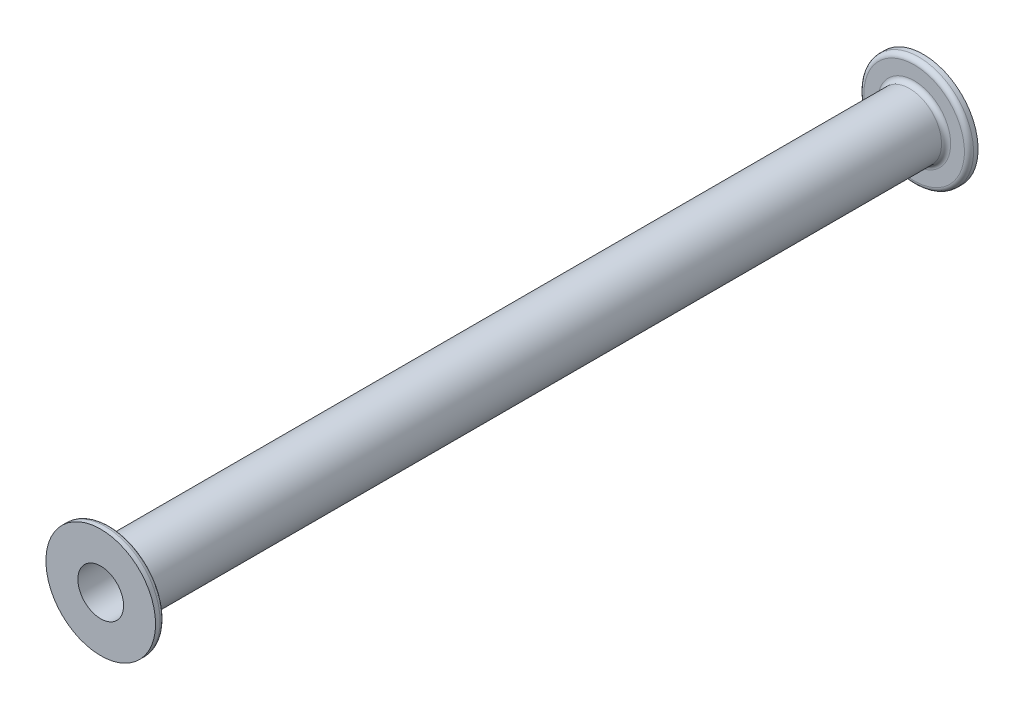
ISO-10303-21;
HEADER;
FILE_DESCRIPTION(('STEP AP214'),'2;1');
FILE_NAME('part.step','',(''),(''),'','','');
FILE_SCHEMA(('AUTOMOTIVE_DESIGN { 1 0 10303 214 1 1 1 1 }'));
ENDSEC;
DATA;
#1=APPLICATION_CONTEXT('core data for automotive mechanical design processes');
#2=APPLICATION_PROTOCOL_DEFINITION('international standard','automotive_design',2000,#1);
#3=PRODUCT_CONTEXT('',#1,'mechanical');
#4=PRODUCT('Part','Part','',(#3));
#5=PRODUCT_RELATED_PRODUCT_CATEGORY('part','',(#4));
#6=PRODUCT_DEFINITION_FORMATION('','',#4);
#7=PRODUCT_DEFINITION_CONTEXT('part definition',#1,'design');
#8=PRODUCT_DEFINITION('design','',#6,#7);
#9=PRODUCT_DEFINITION_SHAPE('','',#8);
#10=(LENGTH_UNIT() NAMED_UNIT(*) SI_UNIT(.MILLI.,.METRE.));
#11=(NAMED_UNIT(*) PLANE_ANGLE_UNIT() SI_UNIT($,.RADIAN.));
#12=(NAMED_UNIT(*) SI_UNIT($,.STERADIAN.) SOLID_ANGLE_UNIT());
#13=UNCERTAINTY_MEASURE_WITH_UNIT(LENGTH_MEASURE(1.E-05),#10,'distance_accuracy_value','');
#14=(GEOMETRIC_REPRESENTATION_CONTEXT(3) GLOBAL_UNCERTAINTY_ASSIGNED_CONTEXT((#13)) GLOBAL_UNIT_ASSIGNED_CONTEXT((#10,
#11,#12)) REPRESENTATION_CONTEXT('',''));
#15=CARTESIAN_POINT('',(0.,0.,0.));
#16=DIRECTION('',(0.,0.,1.));
#17=DIRECTION('',(1.,0.,0.));
#18=AXIS2_PLACEMENT_3D('',#15,#16,#17);
#19=CARTESIAN_POINT('',(0.,0.,90.));
#20=DIRECTION('',(0.,0.,-1.));
#21=DIRECTION('',(-1.,0.,0.));
#22=AXIS2_PLACEMENT_3D('',#19,#20,#21);
#23=CYLINDRICAL_SURFACE('',#22,3.5);
#24=CARTESIAN_POINT('',(0.,0.,88.5));
#25=DIRECTION('',(0.,0.,1.));
#26=DIRECTION('',(1.,0.,0.));
#27=AXIS2_PLACEMENT_3D('',#24,#25,#26);
#28=CIRCLE('',#27,3.5);
#29=CARTESIAN_POINT('',(-3.5,0.,88.5));
#30=VERTEX_POINT('',#29);
#31=EDGE_CURVE('E53',#30,#30,#28,.F.);
#32=CARTESIAN_POINT('',(0.,0.,1.5));
#33=DIRECTION('',(0.,0.,-1.));
#34=DIRECTION('',(-1.,0.,0.));
#35=AXIS2_PLACEMENT_3D('',#32,#33,#34);
#36=CIRCLE('',#35,3.5);
#37=CARTESIAN_POINT('',(-3.5,0.,1.50000000000002));
#38=VERTEX_POINT('',#37);
#39=EDGE_CURVE('E58',#38,#38,#36,.F.);
#40=CARTESIAN_POINT('',(-3.5,0.,88.5));
#41=CARTESIAN_POINT('',(-3.5,0.,87.59375));
#42=CARTESIAN_POINT('',(-3.5,0.,86.6875));
#43=CARTESIAN_POINT('',(-3.5,0.,84.875));
#44=CARTESIAN_POINT('',(-3.5,0.,83.96875));
#45=CARTESIAN_POINT('',(-3.5,0.,82.15625));
#46=CARTESIAN_POINT('',(-3.5,0.,81.25));
#47=CARTESIAN_POINT('',(-3.5,0.,79.4375));
#48=CARTESIAN_POINT('',(-3.5,0.,78.53125));
#49=CARTESIAN_POINT('',(-3.5,0.,76.71875));
#50=CARTESIAN_POINT('',(-3.5,0.,75.8125));
#51=CARTESIAN_POINT('',(-3.5,0.,74.));
#52=CARTESIAN_POINT('',(-3.5,0.,73.09375));
#53=CARTESIAN_POINT('',(-3.5,0.,71.28125));
#54=CARTESIAN_POINT('',(-3.5,0.,70.375));
#55=CARTESIAN_POINT('',(-3.5,0.,68.5625));
#56=CARTESIAN_POINT('',(-3.5,0.,67.65625));
#57=CARTESIAN_POINT('',(-3.5,0.,65.84375));
#58=CARTESIAN_POINT('',(-3.5,0.,64.9375));
#59=CARTESIAN_POINT('',(-3.5,0.,63.125));
#60=CARTESIAN_POINT('',(-3.5,0.,62.21875));
#61=CARTESIAN_POINT('',(-3.5,0.,60.40625));
#62=CARTESIAN_POINT('',(-3.5,0.,59.5));
#63=CARTESIAN_POINT('',(-3.5,0.,57.6875));
#64=CARTESIAN_POINT('',(-3.5,0.,56.78125));
#65=CARTESIAN_POINT('',(-3.5,0.,54.96875));
#66=CARTESIAN_POINT('',(-3.5,0.,54.0625));
#67=CARTESIAN_POINT('',(-3.5,0.,52.25));
#68=CARTESIAN_POINT('',(-3.5,0.,51.34375));
#69=CARTESIAN_POINT('',(-3.5,0.,49.53125));
#70=CARTESIAN_POINT('',(-3.5,0.,48.625));
#71=CARTESIAN_POINT('',(-3.5,0.,46.8125));
#72=CARTESIAN_POINT('',(-3.5,0.,45.90625));
#73=CARTESIAN_POINT('',(-3.5,0.,44.09375));
#74=CARTESIAN_POINT('',(-3.5,0.,43.1875));
#75=CARTESIAN_POINT('',(-3.5,0.,41.375));
#76=CARTESIAN_POINT('',(-3.5,0.,40.46875));
#77=CARTESIAN_POINT('',(-3.5,0.,38.65625));
#78=CARTESIAN_POINT('',(-3.5,0.,37.75));
#79=CARTESIAN_POINT('',(-3.5,0.,35.9375));
#80=CARTESIAN_POINT('',(-3.5,0.,35.03125));
#81=CARTESIAN_POINT('',(-3.5,0.,33.21875));
#82=CARTESIAN_POINT('',(-3.5,0.,32.3125));
#83=CARTESIAN_POINT('',(-3.5,0.,30.5));
#84=CARTESIAN_POINT('',(-3.5,0.,29.59375));
#85=CARTESIAN_POINT('',(-3.5,0.,27.78125));
#86=CARTESIAN_POINT('',(-3.5,0.,26.875));
#87=CARTESIAN_POINT('',(-3.5,0.,25.0625));
#88=CARTESIAN_POINT('',(-3.5,0.,24.15625));
#89=CARTESIAN_POINT('',(-3.5,0.,22.34375));
#90=CARTESIAN_POINT('',(-3.5,0.,21.4375));
#91=CARTESIAN_POINT('',(-3.5,0.,19.625));
#92=CARTESIAN_POINT('',(-3.5,0.,18.71875));
#93=CARTESIAN_POINT('',(-3.5,0.,16.90625));
#94=CARTESIAN_POINT('',(-3.5,0.,16.));
#95=CARTESIAN_POINT('',(-3.5,0.,14.1875));
#96=CARTESIAN_POINT('',(-3.5,0.,13.28125));
#97=CARTESIAN_POINT('',(-3.5,0.,11.46875));
#98=CARTESIAN_POINT('',(-3.5,0.,10.5625));
#99=CARTESIAN_POINT('',(-3.5,0.,8.75000000000002));
#100=CARTESIAN_POINT('',(-3.5,0.,7.84375000000001));
#101=CARTESIAN_POINT('',(-3.5,0.,6.03125000000002));
#102=CARTESIAN_POINT('',(-3.5,0.,5.12500000000002));
#103=CARTESIAN_POINT('',(-3.5,0.,3.31250000000002));
#104=CARTESIAN_POINT('',(-3.5,0.,2.40625000000002));
#105=CARTESIAN_POINT('',(-3.5,0.,1.50000000000002));
#106=B_SPLINE_CURVE_WITH_KNOTS('',3,(#40,#41,#42,#43,#44,#45,#46,#47,#48,#49,#50,#51,#52,#53,
#54,#55,#56,#57,#58,#59,#60,#61,#62,#63,#64,#65,#66,#67,#68,#69,#70,#71,#72,#73,#74,#75,#76,#77,
#78,#79,#80,#81,#82,#83,#84,#85,#86,#87,#88,#89,#90,#91,#92,#93,#94,#95,#96,#97,#98,#99,#100,
#101,#102,#103,#104,#105),.UNSPECIFIED.,.F.,.F.,(4,2,2,2,2,2,2,2,2,2,2,2,2,2,2,2,2,2,2,2,2,2,2,
2,2,2,2,2,2,2,2,2,4),(0.,2.71874999999999,5.4375,8.15624999999999,10.875,13.59375,16.3125,
19.03125,21.75,24.46875,27.1875,29.90625,32.625,35.34375,38.0625,40.78125,43.5,46.21875,48.9375,
51.65625,54.375,57.09375,59.8125,62.53125,65.25,67.96875,70.6875,73.40625,76.125,78.84375,
81.5625,84.28125,87.),.UNSPECIFIED.);
#107=EDGE_CURVE('BSEAM38',#30,#38,#106,.T.);
#108=ORIENTED_EDGE('',*,*,#31,.T.);
#109=ORIENTED_EDGE('',*,*,#39,.T.);
#110=ORIENTED_EDGE('',*,*,#107,.T.);
#111=ORIENTED_EDGE('',*,*,#107,.F.);
#112=EDGE_LOOP('',(#108,#110,#109,#111));
#113=FACE_BOUND('',#112,.T.);
#114=ADVANCED_FACE('F38',(#113),#23,.T.);
#115=CARTESIAN_POINT('',(0.,0.,90.));
#116=DIRECTION('',(0.,0.,1.));
#117=DIRECTION('',(1.,0.,0.));
#118=AXIS2_PLACEMENT_3D('',#115,#116,#117);
#119=PLANE('',#118);
#120=CARTESIAN_POINT('',(0.,0.,90.));
#121=DIRECTION('',(0.,0.,1.));
#122=DIRECTION('',(1.,0.,0.));
#123=AXIS2_PLACEMENT_3D('',#120,#121,#122);
#124=CIRCLE('',#123,2.5);
#125=CARTESIAN_POINT('',(-2.5,0.,90.));
#126=VERTEX_POINT('',#125);
#127=EDGE_CURVE('E70',#126,#126,#124,.T.);
#128=ORIENTED_EDGE('',*,*,#127,.F.);
#129=EDGE_LOOP('',(#128));
#130=FACE_BOUND('',#129,.T.);
#131=CARTESIAN_POINT('',(0.,0.,90.));
#132=DIRECTION('',(0.,0.,1.));
#133=DIRECTION('',(1.,0.,0.));
#134=AXIS2_PLACEMENT_3D('',#131,#132,#133);
#135=CIRCLE('',#134,6.);
#136=CARTESIAN_POINT('',(6.,0.,90.));
#137=VERTEX_POINT('',#136);
#138=EDGE_CURVE('E79',#137,#137,#135,.T.);
#139=ORIENTED_EDGE('',*,*,#138,.T.);
#140=EDGE_LOOP('',(#139));
#141=FACE_BOUND('',#140,.T.);
#142=ADVANCED_FACE('F83',(#130,#141),#119,.T.);
#143=CARTESIAN_POINT('',(0.,0.,0.));
#144=DIRECTION('',(0.,0.,1.));
#145=DIRECTION('',(1.,0.,0.));
#146=AXIS2_PLACEMENT_3D('',#143,#144,#145);
#147=PLANE('',#146);
#148=CARTESIAN_POINT('',(0.,0.,0.));
#149=DIRECTION('',(0.,0.,1.));
#150=DIRECTION('',(1.,0.,0.));
#151=AXIS2_PLACEMENT_3D('',#148,#149,#150);
#152=CIRCLE('',#151,2.5);
#153=CARTESIAN_POINT('',(-2.5,0.,0.));
#154=VERTEX_POINT('',#153);
#155=EDGE_CURVE('E71',#154,#154,#152,.T.);
#156=ORIENTED_EDGE('',*,*,#155,.T.);
#157=EDGE_LOOP('',(#156));
#158=FACE_BOUND('',#157,.T.);
#159=CARTESIAN_POINT('',(0.,0.,0.));
#160=DIRECTION('',(0.,0.,-1.));
#161=DIRECTION('',(-1.,0.,0.));
#162=AXIS2_PLACEMENT_3D('',#159,#160,#161);
#163=CIRCLE('',#162,6.);
#164=CARTESIAN_POINT('',(-6.,0.,0.));
#165=VERTEX_POINT('',#164);
#166=EDGE_CURVE('E74',#165,#165,#163,.T.);
#167=ORIENTED_EDGE('',*,*,#166,.T.);
#168=EDGE_LOOP('',(#167));
#169=FACE_BOUND('',#168,.T.);
#170=ADVANCED_FACE('F108',(#158,#169),#147,.F.);
#171=CARTESIAN_POINT('',(0.,0.,90.));
#172=DIRECTION('',(0.,0.,-1.));
#173=DIRECTION('',(-1.,0.,0.));
#174=AXIS2_PLACEMENT_3D('',#171,#172,#173);
#175=CYLINDRICAL_SURFACE('',#174,2.5);
#176=CARTESIAN_POINT('',(-2.5,0.,90.));
#177=CARTESIAN_POINT('',(-2.5,0.,89.0625));
#178=CARTESIAN_POINT('',(-2.5,0.,88.125));
#179=CARTESIAN_POINT('',(-2.5,0.,86.25));
#180=CARTESIAN_POINT('',(-2.5,0.,85.3125));
#181=CARTESIAN_POINT('',(-2.5,0.,83.4375));
#182=CARTESIAN_POINT('',(-2.5,0.,82.5));
#183=CARTESIAN_POINT('',(-2.5,0.,80.625));
#184=CARTESIAN_POINT('',(-2.5,0.,79.6875));
#185=CARTESIAN_POINT('',(-2.5,0.,77.8125));
#186=CARTESIAN_POINT('',(-2.5,0.,76.875));
#187=CARTESIAN_POINT('',(-2.5,0.,75.));
#188=CARTESIAN_POINT('',(-2.5,0.,74.0625));
#189=CARTESIAN_POINT('',(-2.5,0.,72.1875));
#190=CARTESIAN_POINT('',(-2.5,0.,71.25));
#191=CARTESIAN_POINT('',(-2.5,0.,69.375));
#192=CARTESIAN_POINT('',(-2.5,0.,68.4375));
#193=CARTESIAN_POINT('',(-2.5,0.,66.5625));
#194=CARTESIAN_POINT('',(-2.5,0.,65.625));
#195=CARTESIAN_POINT('',(-2.5,0.,63.75));
#196=CARTESIAN_POINT('',(-2.5,0.,62.8125));
#197=CARTESIAN_POINT('',(-2.5,0.,60.9375));
#198=CARTESIAN_POINT('',(-2.5,0.,60.));
#199=CARTESIAN_POINT('',(-2.5,0.,58.125));
#200=CARTESIAN_POINT('',(-2.5,0.,57.1875));
#201=CARTESIAN_POINT('',(-2.5,0.,55.3125));
#202=CARTESIAN_POINT('',(-2.5,0.,54.375));
#203=CARTESIAN_POINT('',(-2.5,0.,52.5));
#204=CARTESIAN_POINT('',(-2.5,0.,51.5625));
#205=CARTESIAN_POINT('',(-2.5,0.,49.6875));
#206=CARTESIAN_POINT('',(-2.5,0.,48.75));
#207=CARTESIAN_POINT('',(-2.5,0.,46.875));
#208=CARTESIAN_POINT('',(-2.5,0.,45.9375));
#209=CARTESIAN_POINT('',(-2.5,0.,44.0625));
#210=CARTESIAN_POINT('',(-2.5,0.,43.125));
#211=CARTESIAN_POINT('',(-2.5,0.,41.25));
#212=CARTESIAN_POINT('',(-2.5,0.,40.3125));
#213=CARTESIAN_POINT('',(-2.5,0.,38.4375));
#214=CARTESIAN_POINT('',(-2.5,0.,37.5));
#215=CARTESIAN_POINT('',(-2.5,0.,35.625));
#216=CARTESIAN_POINT('',(-2.5,0.,34.6875));
#217=CARTESIAN_POINT('',(-2.5,0.,32.8125));
#218=CARTESIAN_POINT('',(-2.5,0.,31.875));
#219=CARTESIAN_POINT('',(-2.5,0.,30.));
#220=CARTESIAN_POINT('',(-2.5,0.,29.0625));
#221=CARTESIAN_POINT('',(-2.5,0.,27.1875));
#222=CARTESIAN_POINT('',(-2.5,0.,26.25));
#223=CARTESIAN_POINT('',(-2.5,0.,24.375));
#224=CARTESIAN_POINT('',(-2.5,0.,23.4375));
#225=CARTESIAN_POINT('',(-2.5,0.,21.5625));
#226=CARTESIAN_POINT('',(-2.5,0.,20.625));
#227=CARTESIAN_POINT('',(-2.5,0.,18.75));
#228=CARTESIAN_POINT('',(-2.5,0.,17.8125));
#229=CARTESIAN_POINT('',(-2.5,0.,15.9375));
#230=CARTESIAN_POINT('',(-2.5,0.,15.));
#231=CARTESIAN_POINT('',(-2.5,0.,13.125));
#232=CARTESIAN_POINT('',(-2.5,0.,12.1875));
#233=CARTESIAN_POINT('',(-2.5,0.,10.3125));
#234=CARTESIAN_POINT('',(-2.5,0.,9.37499999999999));
#235=CARTESIAN_POINT('',(-2.5,0.,7.49999999999999));
#236=CARTESIAN_POINT('',(-2.5,0.,6.56249999999999));
#237=CARTESIAN_POINT('',(-2.5,0.,4.68749999999999));
#238=CARTESIAN_POINT('',(-2.5,0.,3.74999999999998));
#239=CARTESIAN_POINT('',(-2.5,0.,1.87499999999998));
#240=CARTESIAN_POINT('',(-2.5,0.,0.937499999999986));
#241=CARTESIAN_POINT('',(-2.5,0.,0.));
#242=B_SPLINE_CURVE_WITH_KNOTS('',3,(#176,#177,#178,#179,#180,#181,#182,#183,#184,#185,#186,
#187,#188,#189,#190,#191,#192,#193,#194,#195,#196,#197,#198,#199,#200,#201,#202,#203,#204,#205,
#206,#207,#208,#209,#210,#211,#212,#213,#214,#215,#216,#217,#218,#219,#220,#221,#222,#223,#224,
#225,#226,#227,#228,#229,#230,#231,#232,#233,#234,#235,#236,#237,#238,#239,#240,#241),
.UNSPECIFIED.,.F.,.F.,(4,2,2,2,2,2,2,2,2,2,2,2,2,2,2,2,2,2,2,2,2,2,2,2,2,2,2,2,2,2,2,2,4),(0.,
2.81250000000001,5.62500000000001,8.43750000000001,11.25,14.0625,16.875,19.6875,22.5,25.3125,
28.125,30.9375,33.75,36.5625,39.375,42.1875,45.,47.8125,50.625,53.4375,56.25,59.0625,61.875,
64.6875,67.5,70.3125,73.125,75.9375,78.75,81.5625,84.375,87.1875,90.),.UNSPECIFIED.);
#243=EDGE_CURVE('BSEAM132',#126,#154,#242,.T.);
#244=ORIENTED_EDGE('',*,*,#127,.T.);
#245=ORIENTED_EDGE('',*,*,#155,.F.);
#246=ORIENTED_EDGE('',*,*,#243,.T.);
#247=ORIENTED_EDGE('',*,*,#243,.F.);
#248=EDGE_LOOP('',(#244,#246,#245,#247));
#249=FACE_BOUND('',#248,.T.);
#250=ADVANCED_FACE('F132',(#249),#175,.F.);
#251=CARTESIAN_POINT('',(0.,0.,1.));
#252=DIRECTION('',(0.,0.,-1.));
#253=DIRECTION('',(-1.,0.,0.));
#254=AXIS2_PLACEMENT_3D('',#251,#252,#253);
#255=PLANE('',#254);
#256=CARTESIAN_POINT('',(0.,0.,1.));
#257=DIRECTION('',(0.,0.,-1.));
#258=DIRECTION('',(-1.,0.,0.));
#259=AXIS2_PLACEMENT_3D('',#256,#257,#258);
#260=CIRCLE('',#259,4.);
#261=CARTESIAN_POINT('',(-4.,0.,1.));
#262=VERTEX_POINT('',#261);
#263=EDGE_CURVE('E45',#262,#262,#260,.T.);
#264=ORIENTED_EDGE('',*,*,#263,.T.);
#265=EDGE_LOOP('',(#264));
#266=FACE_BOUND('',#265,.T.);
#267=CARTESIAN_POINT('',(0.,0.,1.));
#268=DIRECTION('',(0.,0.,-1.));
#269=DIRECTION('',(-1.,0.,0.));
#270=AXIS2_PLACEMENT_3D('',#267,#268,#269);
#271=CIRCLE('',#270,5.5);
#272=CARTESIAN_POINT('',(-5.5,0.,1.));
#273=VERTEX_POINT('',#272);
#274=EDGE_CURVE('E49',#273,#273,#271,.F.);
#275=ORIENTED_EDGE('',*,*,#274,.T.);
#276=EDGE_LOOP('',(#275));
#277=FACE_BOUND('',#276,.T.);
#278=ADVANCED_FACE('F130',(#266,#277),#255,.F.);
#279=CARTESIAN_POINT('',(0.,0.,1.));
#280=DIRECTION('',(0.,0.,-1.));
#281=DIRECTION('',(-1.,0.,0.));
#282=AXIS2_PLACEMENT_3D('',#279,#280,#281);
#283=CYLINDRICAL_SURFACE('',#282,6.);
#284=CARTESIAN_POINT('',(0.,0.,0.5));
#285=DIRECTION('',(0.,0.,-1.));
#286=DIRECTION('',(-1.,0.,0.));
#287=AXIS2_PLACEMENT_3D('',#284,#285,#286);
#288=CIRCLE('',#287,6.);
#289=CARTESIAN_POINT('',(-6.,0.,0.5));
#290=VERTEX_POINT('',#289);
#291=EDGE_CURVE('E11',#290,#290,#288,.T.);
#292=ORIENTED_EDGE('',*,*,#291,.T.);
#293=EDGE_LOOP('',(#292));
#294=FACE_BOUND('',#293,.T.);
#295=ORIENTED_EDGE('',*,*,#166,.F.);
#296=EDGE_LOOP('',(#295));
#297=FACE_BOUND('',#296,.T.);
#298=ADVANCED_FACE('F98',(#294,#297),#283,.T.);
#299=CARTESIAN_POINT('',(0.,0.,89.));
#300=DIRECTION('',(0.,0.,1.));
#301=DIRECTION('',(1.,0.,0.));
#302=AXIS2_PLACEMENT_3D('',#299,#300,#301);
#303=PLANE('',#302);
#304=CARTESIAN_POINT('',(0.,0.,89.));
#305=DIRECTION('',(0.,0.,1.));
#306=DIRECTION('',(1.,0.,0.));
#307=AXIS2_PLACEMENT_3D('',#304,#305,#306);
#308=CIRCLE('',#307,5.5);
#309=CARTESIAN_POINT('',(5.5,0.,89.));
#310=VERTEX_POINT('',#309);
#311=EDGE_CURVE('E61',#310,#310,#308,.F.);
#312=ORIENTED_EDGE('',*,*,#311,.T.);
#313=EDGE_LOOP('',(#312));
#314=FACE_BOUND('',#313,.T.);
#315=CARTESIAN_POINT('',(0.,0.,89.));
#316=DIRECTION('',(0.,0.,1.));
#317=DIRECTION('',(1.,0.,0.));
#318=AXIS2_PLACEMENT_3D('',#315,#316,#317);
#319=CIRCLE('',#318,4.);
#320=CARTESIAN_POINT('',(4.,0.,89.));
#321=VERTEX_POINT('',#320);
#322=EDGE_CURVE('E64',#321,#321,#319,.T.);
#323=ORIENTED_EDGE('',*,*,#322,.T.);
#324=EDGE_LOOP('',(#323));
#325=FACE_BOUND('',#324,.T.);
#326=ADVANCED_FACE('F88',(#314,#325),#303,.F.);
#327=CARTESIAN_POINT('',(0.,0.,89.));
#328=DIRECTION('',(0.,0.,1.));
#329=DIRECTION('',(1.,0.,0.));
#330=AXIS2_PLACEMENT_3D('',#327,#328,#329);
#331=CYLINDRICAL_SURFACE('',#330,6.);
#332=CARTESIAN_POINT('',(0.,0.,89.5));
#333=DIRECTION('',(0.,0.,1.));
#334=DIRECTION('',(1.,0.,0.));
#335=AXIS2_PLACEMENT_3D('',#332,#333,#334);
#336=CIRCLE('',#335,6.);
#337=CARTESIAN_POINT('',(6.,0.,89.5));
#338=VERTEX_POINT('',#337);
#339=EDGE_CURVE('E67',#338,#338,#336,.T.);
#340=ORIENTED_EDGE('',*,*,#339,.T.);
#341=EDGE_LOOP('',(#340));
#342=FACE_BOUND('',#341,.T.);
#343=ORIENTED_EDGE('',*,*,#138,.F.);
#344=EDGE_LOOP('',(#343));
#345=FACE_BOUND('',#344,.T.);
#346=ADVANCED_FACE('F85',(#342,#345),#331,.T.);
#347=CARTESIAN_POINT('',(0.,0.,89.5));
#348=DIRECTION('',(0.,0.,1.));
#349=DIRECTION('',(1.,0.,0.));
#350=AXIS2_PLACEMENT_3D('',#347,#348,#349);
#351=TOROIDAL_SURFACE('',#350,5.5,0.5);
#352=ORIENTED_EDGE('',*,*,#311,.F.);
#353=EDGE_LOOP('',(#352));
#354=FACE_BOUND('',#353,.T.);
#355=ORIENTED_EDGE('',*,*,#339,.F.);
#356=EDGE_LOOP('',(#355));
#357=FACE_BOUND('',#356,.T.);
#358=ADVANCED_FACE('F87',(#354,#357),#351,.T.);
#359=CARTESIAN_POINT('',(0.,0.,88.5));
#360=DIRECTION('',(0.,0.,1.));
#361=DIRECTION('',(1.,0.,0.));
#362=AXIS2_PLACEMENT_3D('',#359,#360,#361);
#363=TOROIDAL_SURFACE('',#362,4.,0.5);
#364=ORIENTED_EDGE('',*,*,#31,.F.);
#365=EDGE_LOOP('',(#364));
#366=FACE_BOUND('',#365,.T.);
#367=ORIENTED_EDGE('',*,*,#322,.F.);
#368=EDGE_LOOP('',(#367));
#369=FACE_BOUND('',#368,.T.);
#370=ADVANCED_FACE('F95',(#366,#369),#363,.F.);
#371=CARTESIAN_POINT('',(0.,0.,1.5));
#372=DIRECTION('',(0.,0.,-1.));
#373=DIRECTION('',(-1.,0.,0.));
#374=AXIS2_PLACEMENT_3D('',#371,#372,#373);
#375=TOROIDAL_SURFACE('',#374,4.,0.5);
#376=ORIENTED_EDGE('',*,*,#39,.F.);
#377=EDGE_LOOP('',(#376));
#378=FACE_BOUND('',#377,.T.);
#379=ORIENTED_EDGE('',*,*,#263,.F.);
#380=EDGE_LOOP('',(#379));
#381=FACE_BOUND('',#380,.T.);
#382=ADVANCED_FACE('F115',(#378,#381),#375,.F.);
#383=CARTESIAN_POINT('',(0.,0.,0.5));
#384=DIRECTION('',(0.,0.,-1.));
#385=DIRECTION('',(-1.,0.,0.));
#386=AXIS2_PLACEMENT_3D('',#383,#384,#385);
#387=TOROIDAL_SURFACE('',#386,5.5,0.5);
#388=ORIENTED_EDGE('',*,*,#274,.F.);
#389=EDGE_LOOP('',(#388));
#390=FACE_BOUND('',#389,.T.);
#391=ORIENTED_EDGE('',*,*,#291,.F.);
#392=EDGE_LOOP('',(#391));
#393=FACE_BOUND('',#392,.T.);
#394=ADVANCED_FACE('F40',(#390,#393),#387,.T.);
#395=CLOSED_SHELL('',(#114,#142,#170,#250,#278,#298,#326,#346,#358,#370,#382,#394));
#396=MANIFOLD_SOLID_BREP('B2',#395);
#397=ADVANCED_BREP_SHAPE_REPRESENTATION('',(#18,#396),#14);
#398=SHAPE_DEFINITION_REPRESENTATION(#9,#397);
ENDSEC;
END-ISO-10303-21;
